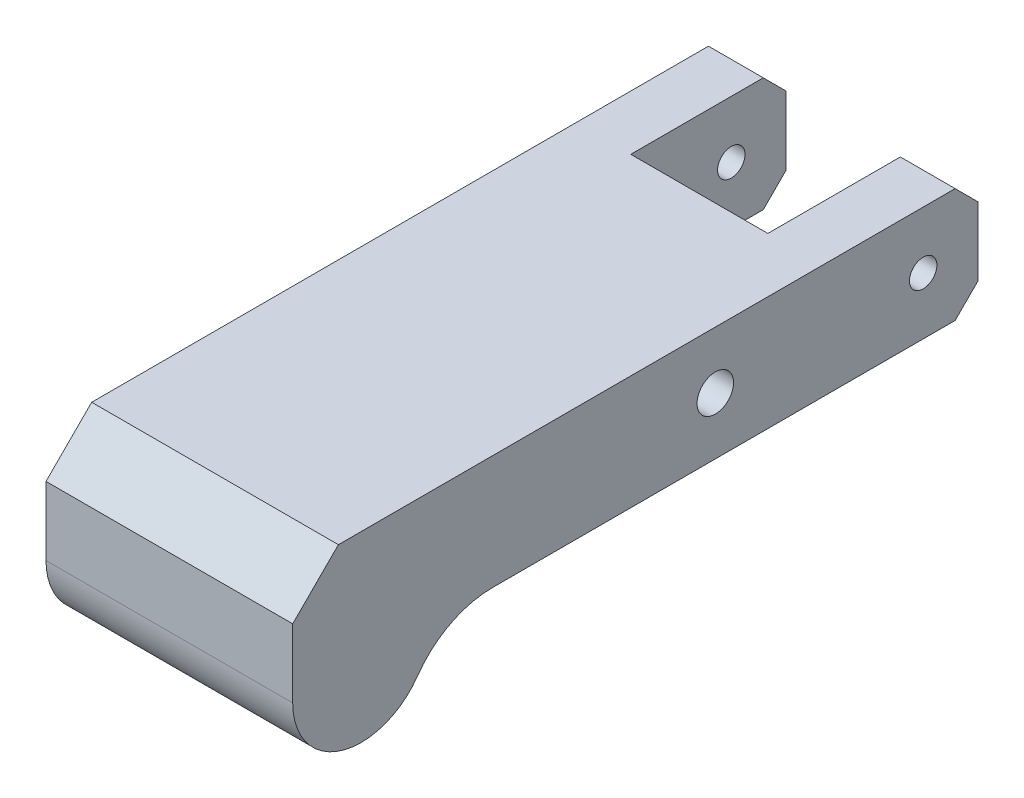
ISO-10303-21;
HEADER;
FILE_DESCRIPTION(('STEP AP214'),'2;1');
FILE_NAME('part.step','',(''),(''),'','','');
FILE_SCHEMA(('AUTOMOTIVE_DESIGN { 1 0 10303 214 1 1 1 1 }'));
ENDSEC;
DATA;
#1=APPLICATION_CONTEXT('core data for automotive mechanical design processes');
#2=APPLICATION_PROTOCOL_DEFINITION('international standard','automotive_design',2000,#1);
#3=PRODUCT_CONTEXT('',#1,'mechanical');
#4=PRODUCT('Part','Part','',(#3));
#5=PRODUCT_RELATED_PRODUCT_CATEGORY('part','',(#4));
#6=PRODUCT_DEFINITION_FORMATION('','',#4);
#7=PRODUCT_DEFINITION_CONTEXT('part definition',#1,'design');
#8=PRODUCT_DEFINITION('design','',#6,#7);
#9=PRODUCT_DEFINITION_SHAPE('','',#8);
#10=(LENGTH_UNIT() NAMED_UNIT(*) SI_UNIT(.MILLI.,.METRE.));
#11=(NAMED_UNIT(*) PLANE_ANGLE_UNIT() SI_UNIT($,.RADIAN.));
#12=(NAMED_UNIT(*) SI_UNIT($,.STERADIAN.) SOLID_ANGLE_UNIT());
#13=UNCERTAINTY_MEASURE_WITH_UNIT(LENGTH_MEASURE(1.E-05),#10,'distance_accuracy_value','');
#14=(GEOMETRIC_REPRESENTATION_CONTEXT(3) GLOBAL_UNCERTAINTY_ASSIGNED_CONTEXT((#13)) GLOBAL_UNIT_ASSIGNED_CONTEXT((#10,
#11,#12)) REPRESENTATION_CONTEXT('',''));
#15=CARTESIAN_POINT('',(0.,0.,0.));
#16=DIRECTION('',(0.,0.,1.));
#17=DIRECTION('',(1.,0.,0.));
#18=AXIS2_PLACEMENT_3D('',#15,#16,#17);
#19=CARTESIAN_POINT('',(54.,-9.15584415584417,40.4545454545455));
#20=DIRECTION('',(0.,0.707106781186549,0.707106781186547));
#21=DIRECTION('',(0.,-0.707106781186546,0.707106781186549));
#22=AXIS2_PLACEMENT_3D('',#19,#20,#21);
#23=PLANE('',#22);
#24=DIRECTION('',(-1.,0.,0.));
#25=VECTOR('',#24,1.);
#26=CARTESIAN_POINT('',(54.,-4.15584415584418,35.4545454545455));
#27=LINE('',#26,#25);
#28=CARTESIAN_POINT('',(12.,-4.15584415584418,35.4545454545455));
#29=VERTEX_POINT('',#28);
#30=CARTESIAN_POINT('',(0.,-4.15584415584418,35.4545454545455));
#31=VERTEX_POINT('',#30);
#32=EDGE_CURVE('E190',#29,#31,#27,.T.);
#33=ORIENTED_EDGE('',*,*,#32,.F.);
#34=DIRECTION('',(0.,-0.707106781186546,0.707106781186549));
#35=VECTOR('',#34,1.);
#36=CARTESIAN_POINT('',(12.,-9.15584415584417,40.4545454545455));
#37=LINE('',#36,#35);
#38=CARTESIAN_POINT('',(12.,-9.15584415584417,40.4545454545455));
#39=VERTEX_POINT('',#38);
#40=EDGE_CURVE('E275',#29,#39,#37,.T.);
#41=ORIENTED_EDGE('',*,*,#40,.T.);
#42=DIRECTION('',(-1.,0.,0.));
#43=VECTOR('',#42,1.);
#44=CARTESIAN_POINT('',(54.,-9.15584415584417,40.4545454545455));
#45=LINE('',#44,#43);
#46=CARTESIAN_POINT('',(0.,-9.15584415584417,40.4545454545455));
#47=VERTEX_POINT('',#46);
#48=EDGE_CURVE('E194',#39,#47,#45,.T.);
#49=ORIENTED_EDGE('',*,*,#48,.T.);
#50=DIRECTION('',(0.,0.707106781186547,-0.707106781186549));
#51=VECTOR('',#50,1.);
#52=CARTESIAN_POINT('',(0.,-9.15584415584417,40.4545454545455));
#53=LINE('',#52,#51);
#54=EDGE_CURVE('E168',#47,#31,#53,.T.);
#55=ORIENTED_EDGE('',*,*,#54,.T.);
#56=EDGE_LOOP('',(#33,#41,#49,#55));
#57=FACE_BOUND('',#56,.T.);
#58=ADVANCED_FACE('F42',(#57),#23,.F.);
#59=CARTESIAN_POINT('',(54.,10.8441558441558,35.4545454545455));
#60=DIRECTION('',(0.,0.,1.));
#61=DIRECTION('',(1.,0.,0.));
#62=AXIS2_PLACEMENT_3D('',#59,#60,#61);
#63=PLANE('',#62);
#64=DIRECTION('',(-1.,0.,0.));
#65=VECTOR('',#64,1.);
#66=CARTESIAN_POINT('',(54.,10.8441558441558,35.4545454545455));
#67=LINE('',#66,#65);
#68=CARTESIAN_POINT('',(12.,10.8441558441558,35.4545454545455));
#69=VERTEX_POINT('',#68);
#70=CARTESIAN_POINT('',(0.,10.8441558441558,35.4545454545455));
#71=VERTEX_POINT('',#70);
#72=EDGE_CURVE('E186',#69,#71,#67,.T.);
#73=ORIENTED_EDGE('',*,*,#72,.F.);
#74=DIRECTION('',(0.,1.,0.));
#75=VECTOR('',#74,1.);
#76=CARTESIAN_POINT('',(12.,-24.1558441558442,35.4545454545455));
#77=LINE('',#76,#75);
#78=EDGE_CURVE('E270',#29,#69,#77,.T.);
#79=ORIENTED_EDGE('',*,*,#78,.F.);
#80=ORIENTED_EDGE('',*,*,#32,.T.);
#81=DIRECTION('',(0.,1.,0.));
#82=VECTOR('',#81,1.);
#83=CARTESIAN_POINT('',(0.,10.8441558441558,35.4545454545455));
#84=LINE('',#83,#82);
#85=EDGE_CURVE('E171',#31,#71,#84,.T.);
#86=ORIENTED_EDGE('',*,*,#85,.T.);
#87=EDGE_LOOP('',(#73,#79,#80,#86));
#88=FACE_BOUND('',#87,.T.);
#89=ADVANCED_FACE('F337',(#88),#63,.F.);
#90=CARTESIAN_POINT('',(54.,15.8441558441558,40.4545454545455));
#91=DIRECTION('',(0.,-0.707106781186548,0.707106781186547));
#92=DIRECTION('',(0.,-0.707106781186547,-0.707106781186548));
#93=AXIS2_PLACEMENT_3D('',#90,#91,#92);
#94=PLANE('',#93);
#95=DIRECTION('',(-1.,0.,0.));
#96=VECTOR('',#95,1.);
#97=CARTESIAN_POINT('',(54.,15.8441558441558,40.4545454545455));
#98=LINE('',#97,#96);
#99=CARTESIAN_POINT('',(12.,15.8441558441558,40.4545454545455));
#100=VERTEX_POINT('',#99);
#101=CARTESIAN_POINT('',(0.,15.8441558441558,40.4545454545455));
#102=VERTEX_POINT('',#101);
#103=EDGE_CURVE('E150',#100,#102,#98,.T.);
#104=ORIENTED_EDGE('',*,*,#103,.F.);
#105=DIRECTION('',(0.,-0.707106781186547,-0.707106781186548));
#106=VECTOR('',#105,1.);
#107=CARTESIAN_POINT('',(12.,15.8441558441558,40.4545454545455));
#108=LINE('',#107,#106);
#109=EDGE_CURVE('E280',#100,#69,#108,.T.);
#110=ORIENTED_EDGE('',*,*,#109,.T.);
#111=ORIENTED_EDGE('',*,*,#72,.T.);
#112=DIRECTION('',(0.,0.707106781186547,0.707106781186549));
#113=VECTOR('',#112,1.);
#114=CARTESIAN_POINT('',(0.,15.8441558441558,40.4545454545455));
#115=LINE('',#114,#113);
#116=EDGE_CURVE('E174',#71,#102,#115,.T.);
#117=ORIENTED_EDGE('',*,*,#116,.T.);
#118=EDGE_LOOP('',(#104,#110,#111,#117));
#119=FACE_BOUND('',#118,.T.);
#120=ADVANCED_FACE('F344',(#119),#94,.F.);
#121=CARTESIAN_POINT('',(54.,-9.15584415584417,170.454545454545));
#122=DIRECTION('',(-1.,0.,0.));
#123=DIRECTION('',(0.,0.,1.));
#124=AXIS2_PLACEMENT_3D('',#121,#122,#123);
#125=CYLINDRICAL_SURFACE('',#124,15.);
#126=CARTESIAN_POINT('',(0.,-9.15584415584417,170.454545454545));
#127=DIRECTION('',(1.,0.,0.));
#128=DIRECTION('',(0.,0.,-1.));
#129=AXIS2_PLACEMENT_3D('',#126,#127,#128);
#130=CIRCLE('',#129,15.);
#131=CARTESIAN_POINT('',(0.,-9.15584415584417,185.454545454545));
#132=VERTEX_POINT('',#131);
#133=CARTESIAN_POINT('',(0.,-17.7272727272727,158.144768354821));
#134=VERTEX_POINT('',#133);
#135=EDGE_CURVE('E159',#132,#134,#130,.T.);
#136=ORIENTED_EDGE('',*,*,#135,.T.);
#137=DIRECTION('',(-1.,0.,0.));
#138=VECTOR('',#137,1.);
#139=CARTESIAN_POINT('',(54.,-17.7272727272727,158.144768354821));
#140=LINE('',#139,#138);
#141=CARTESIAN_POINT('',(54.,-17.7272727272727,158.144768354821));
#142=VERTEX_POINT('',#141);
#143=EDGE_CURVE('E51',#142,#134,#140,.T.);
#144=ORIENTED_EDGE('',*,*,#143,.F.);
#145=CARTESIAN_POINT('',(54.,-9.15584415584417,170.454545454545));
#146=DIRECTION('',(1.,0.,0.));
#147=DIRECTION('',(0.,0.,-1.));
#148=AXIS2_PLACEMENT_3D('',#145,#146,#147);
#149=CIRCLE('',#148,15.);
#150=CARTESIAN_POINT('',(54.,-9.15584415584417,185.454545454545));
#151=VERTEX_POINT('',#150);
#152=EDGE_CURVE('E181',#151,#142,#149,.T.);
#153=ORIENTED_EDGE('',*,*,#152,.F.);
#154=DIRECTION('',(-1.,0.,0.));
#155=VECTOR('',#154,1.);
#156=CARTESIAN_POINT('',(54.,-9.15584415584417,185.454545454545));
#157=LINE('',#156,#155);
#158=EDGE_CURVE('E155',#151,#132,#157,.T.);
#159=ORIENTED_EDGE('',*,*,#158,.T.);
#160=EDGE_LOOP('',(#136,#144,#153,#159));
#161=FACE_BOUND('',#160,.T.);
#162=ADVANCED_FACE('F44',(#161),#125,.T.);
#163=CARTESIAN_POINT('',(54.,-29.1558441558442,141.731732221855));
#164=DIRECTION('',(-1.,0.,0.));
#165=DIRECTION('',(0.,0.,1.));
#166=AXIS2_PLACEMENT_3D('',#163,#164,#165);
#167=CYLINDRICAL_SURFACE('',#166,20.);
#168=CARTESIAN_POINT('',(0.,-29.1558441558442,141.731732221855));
#169=DIRECTION('',(-1.,0.,0.));
#170=DIRECTION('',(0.,0.,1.));
#171=AXIS2_PLACEMENT_3D('',#168,#169,#170);
#172=CIRCLE('',#171,20.);
#173=CARTESIAN_POINT('',(0.,-9.15584415584417,141.731732221855));
#174=VERTEX_POINT('',#173);
#175=EDGE_CURVE('E162',#134,#174,#172,.T.);
#176=ORIENTED_EDGE('',*,*,#175,.T.);
#177=DIRECTION('',(-1.,0.,0.));
#178=VECTOR('',#177,1.);
#179=CARTESIAN_POINT('',(54.,-9.15584415584417,141.731732221855));
#180=LINE('',#179,#178);
#181=CARTESIAN_POINT('',(54.,-9.15584415584417,141.731732221855));
#182=VERTEX_POINT('',#181);
#183=EDGE_CURVE('E198',#182,#174,#180,.T.);
#184=ORIENTED_EDGE('',*,*,#183,.F.);
#185=CARTESIAN_POINT('',(54.,-29.1558441558442,141.731732221855));
#186=DIRECTION('',(-1.,0.,0.));
#187=DIRECTION('',(0.,0.,1.));
#188=AXIS2_PLACEMENT_3D('',#185,#186,#187);
#189=CIRCLE('',#188,20.);
#190=EDGE_CURVE('E112',#142,#182,#189,.T.);
#191=ORIENTED_EDGE('',*,*,#190,.F.);
#192=ORIENTED_EDGE('',*,*,#143,.T.);
#193=EDGE_LOOP('',(#176,#184,#191,#192));
#194=FACE_BOUND('',#193,.T.);
#195=ADVANCED_FACE('F202',(#194),#167,.F.);
#196=CARTESIAN_POINT('',(54.,-9.15584415584417,141.731732221855));
#197=DIRECTION('',(0.,1.,0.));
#198=DIRECTION('',(0.,0.,1.));
#199=AXIS2_PLACEMENT_3D('',#196,#197,#198);
#200=PLANE('',#199);
#201=ORIENTED_EDGE('',*,*,#48,.F.);
#202=DIRECTION('',(0.,0.,1.));
#203=VECTOR('',#202,1.);
#204=CARTESIAN_POINT('',(12.,-9.15584415584417,141.731732221855));
#205=LINE('',#204,#203);
#206=CARTESIAN_POINT('',(12.,-9.15584415584417,69.4545454545455));
#207=VERTEX_POINT('',#206);
#208=EDGE_CURVE('E163',#39,#207,#205,.T.);
#209=ORIENTED_EDGE('',*,*,#208,.T.);
#210=DIRECTION('',(1.,0.,0.));
#211=VECTOR('',#210,1.);
#212=CARTESIAN_POINT('',(54.,-9.15584415584417,69.4545454545455));
#213=LINE('',#212,#211);
#214=CARTESIAN_POINT('',(42.,-9.15584415584417,69.4545454545455));
#215=VERTEX_POINT('',#214);
#216=EDGE_CURVE('E290',#207,#215,#213,.T.);
#217=ORIENTED_EDGE('',*,*,#216,.T.);
#218=DIRECTION('',(0.,0.,-1.));
#219=VECTOR('',#218,1.);
#220=CARTESIAN_POINT('',(42.,-9.15584415584417,141.731732221855));
#221=LINE('',#220,#219);
#222=CARTESIAN_POINT('',(42.,-9.15584415584417,40.4545454545455));
#223=VERTEX_POINT('',#222);
#224=EDGE_CURVE('E282',#215,#223,#221,.T.);
#225=ORIENTED_EDGE('',*,*,#224,.T.);
#226=CARTESIAN_POINT('',(54.,-9.15584415584417,40.4545454545455));
#227=VERTEX_POINT('',#226);
#228=EDGE_CURVE('E195',#227,#223,#45,.T.);
#229=ORIENTED_EDGE('',*,*,#228,.F.);
#230=DIRECTION('',(0.,0.,-1.));
#231=VECTOR('',#230,1.);
#232=CARTESIAN_POINT('',(54.,-9.15584415584417,141.731732221855));
#233=LINE('',#232,#231);
#234=EDGE_CURVE('E217',#182,#227,#233,.T.);
#235=ORIENTED_EDGE('',*,*,#234,.F.);
#236=ORIENTED_EDGE('',*,*,#183,.T.);
#237=DIRECTION('',(0.,0.,-1.));
#238=VECTOR('',#237,1.);
#239=CARTESIAN_POINT('',(0.,-9.15584415584417,141.731732221855));
#240=LINE('',#239,#238);
#241=EDGE_CURVE('E165',#174,#47,#240,.T.);
#242=ORIENTED_EDGE('',*,*,#241,.T.);
#243=EDGE_LOOP('',(#201,#209,#217,#225,#229,#235,#236,#242));
#244=FACE_BOUND('',#243,.T.);
#245=ADVANCED_FACE('F213',(#244),#200,.F.);
#246=ORIENTED_EDGE('',*,*,#228,.T.);
#247=DIRECTION('',(0.,0.707106781186546,-0.707106781186549));
#248=VECTOR('',#247,1.);
#249=CARTESIAN_POINT('',(42.,-9.15584415584417,40.4545454545455));
#250=LINE('',#249,#248);
#251=CARTESIAN_POINT('',(42.,-4.15584415584418,35.4545454545455));
#252=VERTEX_POINT('',#251);
#253=EDGE_CURVE('E286',#223,#252,#250,.T.);
#254=ORIENTED_EDGE('',*,*,#253,.T.);
#255=CARTESIAN_POINT('',(54.,-4.15584415584418,35.4545454545455));
#256=VERTEX_POINT('',#255);
#257=EDGE_CURVE('E191',#256,#252,#27,.T.);
#258=ORIENTED_EDGE('',*,*,#257,.F.);
#259=DIRECTION('',(0.,0.707106781186547,-0.707106781186549));
#260=VECTOR('',#259,1.);
#261=CARTESIAN_POINT('',(54.,-9.15584415584417,40.4545454545455));
#262=LINE('',#261,#260);
#263=EDGE_CURVE('E220',#227,#256,#262,.T.);
#264=ORIENTED_EDGE('',*,*,#263,.F.);
#265=EDGE_LOOP('',(#246,#254,#258,#264));
#266=FACE_BOUND('',#265,.T.);
#267=ADVANCED_FACE('F339',(#266),#23,.F.);
#268=ORIENTED_EDGE('',*,*,#257,.T.);
#269=DIRECTION('',(0.,1.,0.));
#270=VECTOR('',#269,1.);
#271=CARTESIAN_POINT('',(42.,-24.1558441558442,35.4545454545455));
#272=LINE('',#271,#270);
#273=CARTESIAN_POINT('',(42.,10.8441558441559,35.4545454545455));
#274=VERTEX_POINT('',#273);
#275=EDGE_CURVE('E235',#252,#274,#272,.T.);
#276=ORIENTED_EDGE('',*,*,#275,.T.);
#277=CARTESIAN_POINT('',(54.,10.8441558441558,35.4545454545455));
#278=VERTEX_POINT('',#277);
#279=EDGE_CURVE('E187',#278,#274,#67,.T.);
#280=ORIENTED_EDGE('',*,*,#279,.F.);
#281=DIRECTION('',(0.,1.,0.));
#282=VECTOR('',#281,1.);
#283=CARTESIAN_POINT('',(54.,10.8441558441558,35.4545454545455));
#284=LINE('',#283,#282);
#285=EDGE_CURVE('E222',#256,#278,#284,.T.);
#286=ORIENTED_EDGE('',*,*,#285,.F.);
#287=EDGE_LOOP('',(#268,#276,#280,#286));
#288=FACE_BOUND('',#287,.T.);
#289=ADVANCED_FACE('F232',(#288),#63,.F.);
#290=ORIENTED_EDGE('',*,*,#279,.T.);
#291=DIRECTION('',(0.,0.707106781186547,0.707106781186548));
#292=VECTOR('',#291,1.);
#293=CARTESIAN_POINT('',(42.,15.8441558441558,40.4545454545455));
#294=LINE('',#293,#292);
#295=CARTESIAN_POINT('',(42.,15.8441558441558,40.4545454545455));
#296=VERTEX_POINT('',#295);
#297=EDGE_CURVE('E241',#274,#296,#294,.T.);
#298=ORIENTED_EDGE('',*,*,#297,.T.);
#299=CARTESIAN_POINT('',(54.,15.8441558441558,40.4545454545455));
#300=VERTEX_POINT('',#299);
#301=EDGE_CURVE('E184',#300,#296,#98,.T.);
#302=ORIENTED_EDGE('',*,*,#301,.F.);
#303=DIRECTION('',(0.,0.707106781186547,0.707106781186549));
#304=VECTOR('',#303,1.);
#305=CARTESIAN_POINT('',(54.,15.8441558441558,40.4545454545455));
#306=LINE('',#305,#304);
#307=EDGE_CURVE('E137',#278,#300,#306,.T.);
#308=ORIENTED_EDGE('',*,*,#307,.F.);
#309=EDGE_LOOP('',(#290,#298,#302,#308));
#310=FACE_BOUND('',#309,.T.);
#311=ADVANCED_FACE('F238',(#310),#94,.F.);
#312=CARTESIAN_POINT('',(54.,15.8441558441558,175.454545454545));
#313=DIRECTION('',(0.,-1.,0.));
#314=DIRECTION('',(0.,0.,-1.));
#315=AXIS2_PLACEMENT_3D('',#312,#313,#314);
#316=PLANE('',#315);
#317=DIRECTION('',(1.,0.,0.));
#318=VECTOR('',#317,1.);
#319=CARTESIAN_POINT('',(12.,15.8441558441558,69.4545454545455));
#320=LINE('',#319,#318);
#321=CARTESIAN_POINT('',(12.,15.8441558441558,69.4545454545455));
#322=VERTEX_POINT('',#321);
#323=CARTESIAN_POINT('',(42.,15.8441558441558,69.4545454545455));
#324=VERTEX_POINT('',#323);
#325=EDGE_CURVE('E298',#322,#324,#320,.T.);
#326=ORIENTED_EDGE('',*,*,#325,.F.);
#327=DIRECTION('',(0.,0.,-1.));
#328=VECTOR('',#327,1.);
#329=CARTESIAN_POINT('',(12.,15.8441558441558,175.454545454545));
#330=LINE('',#329,#328);
#331=EDGE_CURVE('E11',#322,#100,#330,.T.);
#332=ORIENTED_EDGE('',*,*,#331,.T.);
#333=ORIENTED_EDGE('',*,*,#103,.T.);
#334=DIRECTION('',(0.,0.,1.));
#335=VECTOR('',#334,1.);
#336=CARTESIAN_POINT('',(0.,15.8441558441558,175.454545454545));
#337=LINE('',#336,#335);
#338=CARTESIAN_POINT('',(0.,15.8441558441558,175.454545454545));
#339=VERTEX_POINT('',#338);
#340=EDGE_CURVE('E147',#102,#339,#337,.T.);
#341=ORIENTED_EDGE('',*,*,#340,.T.);
#342=DIRECTION('',(-1.,0.,0.));
#343=VECTOR('',#342,1.);
#344=CARTESIAN_POINT('',(54.,15.8441558441558,175.454545454545));
#345=LINE('',#344,#343);
#346=CARTESIAN_POINT('',(54.,15.8441558441558,175.454545454545));
#347=VERTEX_POINT('',#346);
#348=EDGE_CURVE('E143',#347,#339,#345,.T.);
#349=ORIENTED_EDGE('',*,*,#348,.F.);
#350=DIRECTION('',(0.,0.,1.));
#351=VECTOR('',#350,1.);
#352=CARTESIAN_POINT('',(54.,15.8441558441558,175.454545454545));
#353=LINE('',#352,#351);
#354=EDGE_CURVE('E130',#300,#347,#353,.T.);
#355=ORIENTED_EDGE('',*,*,#354,.F.);
#356=ORIENTED_EDGE('',*,*,#301,.T.);
#357=DIRECTION('',(0.,0.,-1.));
#358=VECTOR('',#357,1.);
#359=CARTESIAN_POINT('',(42.,15.8441558441558,35.4545454545455));
#360=LINE('',#359,#358);
#361=EDGE_CURVE('E245',#324,#296,#360,.T.);
#362=ORIENTED_EDGE('',*,*,#361,.F.);
#363=EDGE_LOOP('',(#326,#332,#333,#341,#349,#355,#356,#362));
#364=FACE_BOUND('',#363,.T.);
#365=ADVANCED_FACE('F145',(#364),#316,.F.);
#366=CARTESIAN_POINT('',(54.,5.84415584415583,185.454545454545));
#367=DIRECTION('',(0.,-0.707106781186548,-0.707106781186547));
#368=DIRECTION('',(0.,0.707106781186547,-0.707106781186548));
#369=AXIS2_PLACEMENT_3D('',#366,#367,#368);
#370=PLANE('',#369);
#371=DIRECTION('',(0.,-0.707106781186547,0.707106781186548));
#372=VECTOR('',#371,1.);
#373=CARTESIAN_POINT('',(0.,5.84415584415583,185.454545454545));
#374=LINE('',#373,#372);
#375=CARTESIAN_POINT('',(0.,5.84415584415583,185.454545454545));
#376=VERTEX_POINT('',#375);
#377=EDGE_CURVE('E178',#339,#376,#374,.T.);
#378=ORIENTED_EDGE('',*,*,#377,.T.);
#379=DIRECTION('',(-1.,0.,0.));
#380=VECTOR('',#379,1.);
#381=CARTESIAN_POINT('',(54.,5.84415584415583,185.454545454545));
#382=LINE('',#381,#380);
#383=CARTESIAN_POINT('',(54.,5.84415584415583,185.454545454545));
#384=VERTEX_POINT('',#383);
#385=EDGE_CURVE('E151',#384,#376,#382,.T.);
#386=ORIENTED_EDGE('',*,*,#385,.F.);
#387=DIRECTION('',(0.,-0.707106781186547,0.707106781186548));
#388=VECTOR('',#387,1.);
#389=CARTESIAN_POINT('',(54.,5.84415584415583,185.454545454545));
#390=LINE('',#389,#388);
#391=EDGE_CURVE('E134',#347,#384,#390,.T.);
#392=ORIENTED_EDGE('',*,*,#391,.F.);
#393=ORIENTED_EDGE('',*,*,#348,.T.);
#394=EDGE_LOOP('',(#378,#386,#392,#393));
#395=FACE_BOUND('',#394,.T.);
#396=ADVANCED_FACE('F153',(#395),#370,.F.);
#397=CARTESIAN_POINT('',(54.,5.84415584415583,185.454545454545));
#398=DIRECTION('',(0.,0.,-1.));
#399=DIRECTION('',(-1.,0.,0.));
#400=AXIS2_PLACEMENT_3D('',#397,#398,#399);
#401=PLANE('',#400);
#402=DIRECTION('',(0.,-1.,0.));
#403=VECTOR('',#402,1.);
#404=CARTESIAN_POINT('',(0.,5.84415584415583,185.454545454545));
#405=LINE('',#404,#403);
#406=EDGE_CURVE('E103',#376,#132,#405,.T.);
#407=ORIENTED_EDGE('',*,*,#406,.T.);
#408=ORIENTED_EDGE('',*,*,#158,.F.);
#409=DIRECTION('',(0.,-1.,0.));
#410=VECTOR('',#409,1.);
#411=CARTESIAN_POINT('',(54.,5.84415584415583,185.454545454545));
#412=LINE('',#411,#410);
#413=EDGE_CURVE('E67',#384,#151,#412,.T.);
#414=ORIENTED_EDGE('',*,*,#413,.F.);
#415=ORIENTED_EDGE('',*,*,#385,.T.);
#416=EDGE_LOOP('',(#407,#408,#414,#415));
#417=FACE_BOUND('',#416,.T.);
#418=ADVANCED_FACE('F360',(#417),#401,.F.);
#419=CARTESIAN_POINT('',(54.,-9.15584415584417,170.454545454545));
#420=DIRECTION('',(1.,0.,0.));
#421=DIRECTION('',(0.,0.,-1.));
#422=AXIS2_PLACEMENT_3D('',#419,#420,#421);
#423=PLANE('',#422);
#424=CARTESIAN_POINT('',(54.,3.34415584415584,47.4545454545455));
#425=DIRECTION('',(1.,0.,0.));
#426=DIRECTION('',(0.,0.,-1.));
#427=AXIS2_PLACEMENT_3D('',#424,#425,#426);
#428=CIRCLE('',#427,3.);
#429=CARTESIAN_POINT('',(54.,3.34415584415584,44.4545454545455));
#430=VERTEX_POINT('',#429);
#431=EDGE_CURVE('E309',#430,#430,#428,.T.);
#432=ORIENTED_EDGE('',*,*,#431,.F.);
#433=EDGE_LOOP('',(#432));
#434=FACE_BOUND('',#433,.T.);
#435=CARTESIAN_POINT('',(54.,3.34415584415584,92.9545454545455));
#436=DIRECTION('',(1.,0.,0.));
#437=DIRECTION('',(0.,0.,-1.));
#438=AXIS2_PLACEMENT_3D('',#435,#436,#437);
#439=CIRCLE('',#438,4.00000000000001);
#440=CARTESIAN_POINT('',(54.,3.34415584415584,88.9545454545455));
#441=VERTEX_POINT('',#440);
#442=EDGE_CURVE('E306',#441,#441,#439,.T.);
#443=ORIENTED_EDGE('',*,*,#442,.F.);
#444=EDGE_LOOP('',(#443));
#445=FACE_BOUND('',#444,.T.);
#446=ORIENTED_EDGE('',*,*,#152,.T.);
#447=ORIENTED_EDGE('',*,*,#190,.T.);
#448=ORIENTED_EDGE('',*,*,#234,.T.);
#449=ORIENTED_EDGE('',*,*,#263,.T.);
#450=ORIENTED_EDGE('',*,*,#285,.T.);
#451=ORIENTED_EDGE('',*,*,#307,.T.);
#452=ORIENTED_EDGE('',*,*,#354,.T.);
#453=ORIENTED_EDGE('',*,*,#391,.T.);
#454=ORIENTED_EDGE('',*,*,#413,.T.);
#455=EDGE_LOOP('',(#446,#447,#448,#449,#450,#451,#452,#453,#454));
#456=FACE_BOUND('',#455,.T.);
#457=ADVANCED_FACE('F132',(#434,#445,#456),#423,.T.);
#458=CARTESIAN_POINT('',(0.,-9.15584415584417,170.454545454545));
#459=DIRECTION('',(1.,0.,0.));
#460=DIRECTION('',(0.,0.,-1.));
#461=AXIS2_PLACEMENT_3D('',#458,#459,#460);
#462=PLANE('',#461);
#463=CARTESIAN_POINT('',(0.,3.34415584415584,47.4545454545455));
#464=DIRECTION('',(1.,0.,0.));
#465=DIRECTION('',(0.,0.,-1.));
#466=AXIS2_PLACEMENT_3D('',#463,#464,#465);
#467=CIRCLE('',#466,3.);
#468=CARTESIAN_POINT('',(0.,3.34415584415584,44.4545454545455));
#469=VERTEX_POINT('',#468);
#470=EDGE_CURVE('E312',#469,#469,#467,.T.);
#471=ORIENTED_EDGE('',*,*,#470,.T.);
#472=EDGE_LOOP('',(#471));
#473=FACE_BOUND('',#472,.T.);
#474=CARTESIAN_POINT('',(0.,3.34415584415584,92.9545454545455));
#475=DIRECTION('',(1.,0.,0.));
#476=DIRECTION('',(0.,0.,-1.));
#477=AXIS2_PLACEMENT_3D('',#474,#475,#476);
#478=CIRCLE('',#477,4.00000000000001);
#479=CARTESIAN_POINT('',(0.,3.34415584415584,88.9545454545455));
#480=VERTEX_POINT('',#479);
#481=EDGE_CURVE('E303',#480,#480,#478,.T.);
#482=ORIENTED_EDGE('',*,*,#481,.T.);
#483=EDGE_LOOP('',(#482));
#484=FACE_BOUND('',#483,.T.);
#485=ORIENTED_EDGE('',*,*,#135,.F.);
#486=ORIENTED_EDGE('',*,*,#406,.F.);
#487=ORIENTED_EDGE('',*,*,#377,.F.);
#488=ORIENTED_EDGE('',*,*,#340,.F.);
#489=ORIENTED_EDGE('',*,*,#116,.F.);
#490=ORIENTED_EDGE('',*,*,#85,.F.);
#491=ORIENTED_EDGE('',*,*,#54,.F.);
#492=ORIENTED_EDGE('',*,*,#241,.F.);
#493=ORIENTED_EDGE('',*,*,#175,.F.);
#494=EDGE_LOOP('',(#485,#486,#487,#488,#489,#490,#491,#492,#493));
#495=FACE_BOUND('',#494,.T.);
#496=ADVANCED_FACE('F207',(#473,#484,#495),#462,.F.);
#497=CARTESIAN_POINT('',(12.,-24.1558441558442,35.4545454545455));
#498=DIRECTION('',(-1.,0.,0.));
#499=DIRECTION('',(0.,0.,1.));
#500=AXIS2_PLACEMENT_3D('',#497,#498,#499);
#501=PLANE('',#500);
#502=CARTESIAN_POINT('',(12.,3.34415584415584,47.4545454545455));
#503=DIRECTION('',(-1.,0.,0.));
#504=DIRECTION('',(0.,0.,1.));
#505=AXIS2_PLACEMENT_3D('',#502,#503,#504);
#506=CIRCLE('',#505,3.);
#507=CARTESIAN_POINT('',(12.,3.34415584415584,50.4545454545455));
#508=VERTEX_POINT('',#507);
#509=EDGE_CURVE('E300',#508,#508,#506,.T.);
#510=ORIENTED_EDGE('',*,*,#509,.T.);
#511=EDGE_LOOP('',(#510));
#512=FACE_BOUND('',#511,.T.);
#513=ORIENTED_EDGE('',*,*,#40,.F.);
#514=ORIENTED_EDGE('',*,*,#78,.T.);
#515=ORIENTED_EDGE('',*,*,#109,.F.);
#516=ORIENTED_EDGE('',*,*,#331,.F.);
#517=DIRECTION('',(0.,1.,0.));
#518=VECTOR('',#517,1.);
#519=CARTESIAN_POINT('',(12.,-24.1558441558442,69.4545454545455));
#520=LINE('',#519,#518);
#521=EDGE_CURVE('E58',#207,#322,#520,.T.);
#522=ORIENTED_EDGE('',*,*,#521,.F.);
#523=ORIENTED_EDGE('',*,*,#208,.F.);
#524=EDGE_LOOP('',(#513,#514,#515,#516,#522,#523));
#525=FACE_BOUND('',#524,.T.);
#526=ADVANCED_FACE('F274',(#512,#525),#501,.F.);
#527=CARTESIAN_POINT('',(42.,-24.1558441558442,35.4545454545455));
#528=DIRECTION('',(1.,0.,0.));
#529=DIRECTION('',(0.,0.,-1.));
#530=AXIS2_PLACEMENT_3D('',#527,#528,#529);
#531=PLANE('',#530);
#532=CARTESIAN_POINT('',(42.,3.34415584415584,47.4545454545455));
#533=DIRECTION('',(1.,0.,0.));
#534=DIRECTION('',(0.,0.,-1.));
#535=AXIS2_PLACEMENT_3D('',#532,#533,#534);
#536=CIRCLE('',#535,3.);
#537=CARTESIAN_POINT('',(42.,3.34415584415584,44.4545454545455));
#538=VERTEX_POINT('',#537);
#539=EDGE_CURVE('E46',#538,#538,#536,.T.);
#540=ORIENTED_EDGE('',*,*,#539,.T.);
#541=EDGE_LOOP('',(#540));
#542=FACE_BOUND('',#541,.T.);
#543=DIRECTION('',(0.,1.,0.));
#544=VECTOR('',#543,1.);
#545=CARTESIAN_POINT('',(42.,-24.1558441558442,69.4545454545455));
#546=LINE('',#545,#544);
#547=EDGE_CURVE('E293',#215,#324,#546,.T.);
#548=ORIENTED_EDGE('',*,*,#547,.T.);
#549=ORIENTED_EDGE('',*,*,#361,.T.);
#550=ORIENTED_EDGE('',*,*,#297,.F.);
#551=ORIENTED_EDGE('',*,*,#275,.F.);
#552=ORIENTED_EDGE('',*,*,#253,.F.);
#553=ORIENTED_EDGE('',*,*,#224,.F.);
#554=EDGE_LOOP('',(#548,#549,#550,#551,#552,#553));
#555=FACE_BOUND('',#554,.T.);
#556=ADVANCED_FACE('F319',(#542,#555),#531,.F.);
#557=CARTESIAN_POINT('',(12.,-24.1558441558442,69.4545454545455));
#558=DIRECTION('',(0.,0.,1.));
#559=DIRECTION('',(1.,0.,0.));
#560=AXIS2_PLACEMENT_3D('',#557,#558,#559);
#561=PLANE('',#560);
#562=ORIENTED_EDGE('',*,*,#521,.T.);
#563=ORIENTED_EDGE('',*,*,#325,.T.);
#564=ORIENTED_EDGE('',*,*,#547,.F.);
#565=ORIENTED_EDGE('',*,*,#216,.F.);
#566=EDGE_LOOP('',(#562,#563,#564,#565));
#567=FACE_BOUND('',#566,.T.);
#568=ADVANCED_FACE('F324',(#567),#561,.F.);
#569=CARTESIAN_POINT('',(0.,3.34415584415584,47.4545454545455));
#570=DIRECTION('',(1.,0.,0.));
#571=DIRECTION('',(0.,0.,-1.));
#572=AXIS2_PLACEMENT_3D('',#569,#570,#571);
#573=CYLINDRICAL_SURFACE('',#572,3.);
#574=ORIENTED_EDGE('',*,*,#431,.T.);
#575=EDGE_LOOP('',(#574));
#576=FACE_BOUND('',#575,.T.);
#577=ORIENTED_EDGE('',*,*,#539,.F.);
#578=EDGE_LOOP('',(#577));
#579=FACE_BOUND('',#578,.T.);
#580=ADVANCED_FACE('F321',(#576,#579),#573,.F.);
#581=ORIENTED_EDGE('',*,*,#470,.F.);
#582=EDGE_LOOP('',(#581));
#583=FACE_BOUND('',#582,.T.);
#584=ORIENTED_EDGE('',*,*,#509,.F.);
#585=EDGE_LOOP('',(#584));
#586=FACE_BOUND('',#585,.T.);
#587=ADVANCED_FACE('F323',(#583,#586),#573,.F.);
#588=CARTESIAN_POINT('',(0.,3.34415584415584,92.9545454545455));
#589=DIRECTION('',(1.,0.,0.));
#590=DIRECTION('',(0.,0.,-1.));
#591=AXIS2_PLACEMENT_3D('',#588,#589,#590);
#592=CYLINDRICAL_SURFACE('',#591,4.00000000000001);
#593=ORIENTED_EDGE('',*,*,#481,.F.);
#594=EDGE_LOOP('',(#593));
#595=FACE_BOUND('',#594,.T.);
#596=ORIENTED_EDGE('',*,*,#442,.T.);
#597=EDGE_LOOP('',(#596));
#598=FACE_BOUND('',#597,.T.);
#599=ADVANCED_FACE('F331',(#595,#598),#592,.F.);
#600=CLOSED_SHELL('',(#58,#89,#120,#162,#195,#245,#267,#289,#311,#365,#396,#418,#457,#496,#526,
#556,#568,#580,#587,#599));
#601=MANIFOLD_SOLID_BREP('B2',#600);
#602=ADVANCED_BREP_SHAPE_REPRESENTATION('',(#18,#601),#14);
#603=SHAPE_DEFINITION_REPRESENTATION(#9,#602);
ENDSEC;
END-ISO-10303-21;
